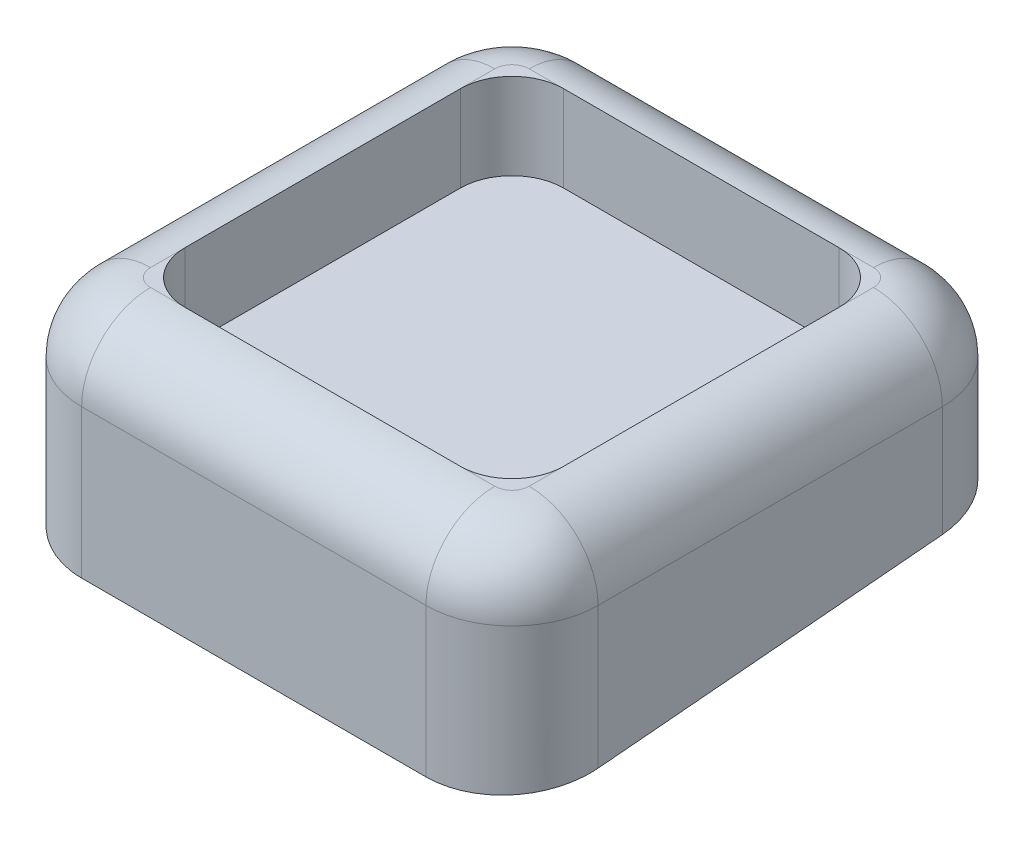
ISO-10303-21;
HEADER;
FILE_DESCRIPTION(('STEP AP214'),'2;1');
FILE_NAME('part.step','',(''),(''),'','','');
FILE_SCHEMA(('AUTOMOTIVE_DESIGN { 1 0 10303 214 1 1 1 1 }'));
ENDSEC;
DATA;
#1=APPLICATION_CONTEXT('core data for automotive mechanical design processes');
#2=APPLICATION_PROTOCOL_DEFINITION('international standard','automotive_design',2000,#1);
#3=PRODUCT_CONTEXT('',#1,'mechanical');
#4=PRODUCT('Part','Part','',(#3));
#5=PRODUCT_RELATED_PRODUCT_CATEGORY('part','',(#4));
#6=PRODUCT_DEFINITION_FORMATION('','',#4);
#7=PRODUCT_DEFINITION_CONTEXT('part definition',#1,'design');
#8=PRODUCT_DEFINITION('design','',#6,#7);
#9=PRODUCT_DEFINITION_SHAPE('','',#8);
#10=(LENGTH_UNIT() NAMED_UNIT(*) SI_UNIT(.MILLI.,.METRE.));
#11=(NAMED_UNIT(*) PLANE_ANGLE_UNIT() SI_UNIT($,.RADIAN.));
#12=(NAMED_UNIT(*) SI_UNIT($,.STERADIAN.) SOLID_ANGLE_UNIT());
#13=UNCERTAINTY_MEASURE_WITH_UNIT(LENGTH_MEASURE(1.E-05),#10,'distance_accuracy_value','');
#14=(GEOMETRIC_REPRESENTATION_CONTEXT(3) GLOBAL_UNCERTAINTY_ASSIGNED_CONTEXT((#13)) GLOBAL_UNIT_ASSIGNED_CONTEXT((#10,
#11,#12)) REPRESENTATION_CONTEXT('',''));
#15=CARTESIAN_POINT('',(0.,0.,0.));
#16=DIRECTION('',(0.,0.,1.));
#17=DIRECTION('',(1.,0.,0.));
#18=AXIS2_PLACEMENT_3D('',#15,#16,#17);
#19=CARTESIAN_POINT('',(30.,5.,0.));
#20=DIRECTION('',(0.,1.,0.));
#21=DIRECTION('',(0.,0.,1.));
#22=AXIS2_PLACEMENT_3D('',#19,#20,#21);
#23=PLANE('',#22);
#24=CARTESIAN_POINT('',(25.,5.,10.));
#25=DIRECTION('',(0.,1.,0.));
#26=DIRECTION('',(0.,0.,1.));
#27=AXIS2_PLACEMENT_3D('',#24,#25,#26);
#28=CIRCLE('',#27,1.);
#29=CARTESIAN_POINT('',(25.,5.,11.));
#30=VERTEX_POINT('',#29);
#31=CARTESIAN_POINT('',(26.,5.,10.));
#32=VERTEX_POINT('',#31);
#33=EDGE_CURVE('E280',#30,#32,#28,.T.);
#34=ORIENTED_EDGE('',*,*,#33,.T.);
#35=DIRECTION('',(0.,0.,-1.));
#36=VECTOR('',#35,1.);
#37=CARTESIAN_POINT('',(26.,5.,0.));
#38=LINE('',#37,#36);
#39=CARTESIAN_POINT('',(26.,5.,8.));
#40=VERTEX_POINT('',#39);
#41=EDGE_CURVE('E282',#32,#40,#38,.T.);
#42=ORIENTED_EDGE('',*,*,#41,.T.);
#43=CARTESIAN_POINT('',(23.,5.,8.));
#44=DIRECTION('',(0.,1.,0.));
#45=DIRECTION('',(0.,0.,1.));
#46=AXIS2_PLACEMENT_3D('',#43,#44,#45);
#47=CIRCLE('',#46,3.);
#48=CARTESIAN_POINT('',(23.,5.,11.));
#49=VERTEX_POINT('',#48);
#50=EDGE_CURVE('E255',#40,#49,#47,.F.);
#51=ORIENTED_EDGE('',*,*,#50,.T.);
#52=DIRECTION('',(-1.,0.,0.));
#53=VECTOR('',#52,1.);
#54=CARTESIAN_POINT('',(25.,5.,11.));
#55=LINE('',#54,#53);
#56=EDGE_CURVE('E278',#49,#30,#55,.F.);
#57=ORIENTED_EDGE('',*,*,#56,.T.);
#58=EDGE_LOOP('',(#34,#42,#51,#57));
#59=FACE_BOUND('',#58,.T.);
#60=ADVANCED_FACE('F37',(#59),#23,.T.);
#61=CARTESIAN_POINT('',(5.,5.,10.));
#62=DIRECTION('',(0.,1.,0.));
#63=DIRECTION('',(0.,0.,1.));
#64=AXIS2_PLACEMENT_3D('',#61,#62,#63);
#65=CIRCLE('',#64,1.);
#66=CARTESIAN_POINT('',(4.,5.,10.));
#67=VERTEX_POINT('',#66);
#68=CARTESIAN_POINT('',(5.,5.,11.));
#69=VERTEX_POINT('',#68);
#70=EDGE_CURVE('E274',#67,#69,#65,.T.);
#71=ORIENTED_EDGE('',*,*,#70,.T.);
#72=DIRECTION('',(-1.,0.,0.));
#73=VECTOR('',#72,1.);
#74=CARTESIAN_POINT('',(25.,5.,11.));
#75=LINE('',#74,#73);
#76=CARTESIAN_POINT('',(7.,5.,11.));
#77=VERTEX_POINT('',#76);
#78=EDGE_CURVE('E276',#69,#77,#75,.F.);
#79=ORIENTED_EDGE('',*,*,#78,.T.);
#80=CARTESIAN_POINT('',(7.,5.,8.));
#81=DIRECTION('',(0.,1.,0.));
#82=DIRECTION('',(0.,0.,1.));
#83=AXIS2_PLACEMENT_3D('',#80,#81,#82);
#84=CIRCLE('',#83,3.);
#85=CARTESIAN_POINT('',(4.,5.,8.));
#86=VERTEX_POINT('',#85);
#87=EDGE_CURVE('E253',#77,#86,#84,.F.);
#88=ORIENTED_EDGE('',*,*,#87,.T.);
#89=DIRECTION('',(0.,0.,-1.));
#90=VECTOR('',#89,1.);
#91=CARTESIAN_POINT('',(4.,5.,10.));
#92=LINE('',#91,#90);
#93=EDGE_CURVE('E272',#86,#67,#92,.F.);
#94=ORIENTED_EDGE('',*,*,#93,.T.);
#95=EDGE_LOOP('',(#71,#79,#88,#94));
#96=FACE_BOUND('',#95,.T.);
#97=ADVANCED_FACE('F435',(#96),#23,.T.);
#98=CARTESIAN_POINT('',(23.,5.,-8.));
#99=DIRECTION('',(0.,1.,0.));
#100=DIRECTION('',(0.,0.,1.));
#101=AXIS2_PLACEMENT_3D('',#98,#99,#100);
#102=CIRCLE('',#101,3.);
#103=CARTESIAN_POINT('',(23.,5.,-11.));
#104=VERTEX_POINT('',#103);
#105=CARTESIAN_POINT('',(26.,5.,-8.));
#106=VERTEX_POINT('',#105);
#107=EDGE_CURVE('E257',#104,#106,#102,.F.);
#108=ORIENTED_EDGE('',*,*,#107,.T.);
#109=DIRECTION('',(0.,0.,-1.));
#110=VECTOR('',#109,1.);
#111=CARTESIAN_POINT('',(26.,5.,0.));
#112=LINE('',#111,#110);
#113=CARTESIAN_POINT('',(26.,5.,-10.));
#114=VERTEX_POINT('',#113);
#115=EDGE_CURVE('E270',#106,#114,#112,.T.);
#116=ORIENTED_EDGE('',*,*,#115,.T.);
#117=CARTESIAN_POINT('',(25.,5.,-10.));
#118=DIRECTION('',(0.,1.,0.));
#119=DIRECTION('',(0.,0.,1.));
#120=AXIS2_PLACEMENT_3D('',#117,#118,#119);
#121=CIRCLE('',#120,1.);
#122=CARTESIAN_POINT('',(25.,5.,-11.));
#123=VERTEX_POINT('',#122);
#124=EDGE_CURVE('E267',#114,#123,#121,.T.);
#125=ORIENTED_EDGE('',*,*,#124,.T.);
#126=DIRECTION('',(-1.,0.,0.));
#127=VECTOR('',#126,1.);
#128=CARTESIAN_POINT('',(5.,5.,-11.));
#129=LINE('',#128,#127);
#130=EDGE_CURVE('E265',#123,#104,#129,.T.);
#131=ORIENTED_EDGE('',*,*,#130,.T.);
#132=EDGE_LOOP('',(#108,#116,#125,#131));
#133=FACE_BOUND('',#132,.T.);
#134=ADVANCED_FACE('F410',(#133),#23,.T.);
#135=CARTESIAN_POINT('',(30.,0.,15.));
#136=DIRECTION('',(0.,0.,-1.));
#137=DIRECTION('',(-1.,0.,0.));
#138=AXIS2_PLACEMENT_3D('',#135,#136,#137);
#139=PLANE('',#138);
#140=DIRECTION('',(0.,-1.,0.));
#141=VECTOR('',#140,1.);
#142=CARTESIAN_POINT('',(25.,5.,15.));
#143=LINE('',#142,#141);
#144=CARTESIAN_POINT('',(25.,-7.625,15.));
#145=VERTEX_POINT('',#144);
#146=CARTESIAN_POINT('',(25.,1.,15.));
#147=VERTEX_POINT('',#146);
#148=EDGE_CURVE('E192',#145,#147,#143,.F.);
#149=ORIENTED_EDGE('',*,*,#148,.T.);
#150=DIRECTION('',(-1.,0.,0.));
#151=VECTOR('',#150,1.);
#152=CARTESIAN_POINT('',(5.,1.,15.));
#153=LINE('',#152,#151);
#154=CARTESIAN_POINT('',(5.,1.,15.));
#155=VERTEX_POINT('',#154);
#156=EDGE_CURVE('E290',#147,#155,#153,.T.);
#157=ORIENTED_EDGE('',*,*,#156,.T.);
#158=DIRECTION('',(0.,-1.,0.));
#159=VECTOR('',#158,1.);
#160=CARTESIAN_POINT('',(5.,0.,15.));
#161=LINE('',#160,#159);
#162=CARTESIAN_POINT('',(5.,-7.625,15.));
#163=VERTEX_POINT('',#162);
#164=EDGE_CURVE('E187',#155,#163,#161,.T.);
#165=ORIENTED_EDGE('',*,*,#164,.T.);
#166=DIRECTION('',(-1.,0.,0.));
#167=VECTOR('',#166,1.);
#168=CARTESIAN_POINT('',(30.,-7.625,15.));
#169=LINE('',#168,#167);
#170=EDGE_CURVE('E180',#145,#163,#169,.T.);
#171=ORIENTED_EDGE('',*,*,#170,.F.);
#172=EDGE_LOOP('',(#149,#157,#165,#171));
#173=FACE_BOUND('',#172,.T.);
#174=ADVANCED_FACE('F191',(#173),#139,.F.);
#175=CARTESIAN_POINT('',(30.,-6.2645371375407,-0.548146999534811));
#176=DIRECTION('',(0.,0.996193717496113,0.0871669502809099));
#177=DIRECTION('',(0.,-0.0871669502809099,0.996193717496113));
#178=AXIS2_PLACEMENT_3D('',#175,#176,#177);
#179=PLANE('',#178);
#180=ORIENTED_EDGE('',*,*,#170,.T.);
#181=CARTESIAN_POINT('',(5.,-7.1875,10.));
#182=DIRECTION('',(0.,0.996193717496113,0.0871669502809099));
#183=DIRECTION('',(0.,-0.0871669502809099,0.996193717496113));
#184=AXIS2_PLACEMENT_3D('',#181,#182,#183);
#185=ELLIPSE('',#184,5.01910412822846,5.);
#186=CARTESIAN_POINT('',(0.,-7.1875,10.));
#187=VERTEX_POINT('',#186);
#188=EDGE_CURVE('E208',#163,#187,#185,.F.);
#189=ORIENTED_EDGE('',*,*,#188,.T.);
#190=DIRECTION('',(0.,0.0871669502809099,-0.996193717496113));
#191=VECTOR('',#190,1.);
#192=CARTESIAN_POINT('',(0.,-6.2645371375407,-0.548146999534811));
#193=LINE('',#192,#191);
#194=CARTESIAN_POINT('',(0.,-5.4375,-10.));
#195=VERTEX_POINT('',#194);
#196=EDGE_CURVE('E341',#187,#195,#193,.T.);
#197=ORIENTED_EDGE('',*,*,#196,.T.);
#198=CARTESIAN_POINT('',(5.,-5.4375,-10.));
#199=DIRECTION('',(0.,0.996193717496113,0.0871669502809099));
#200=DIRECTION('',(0.,0.0871669502809099,-0.996193717496113));
#201=AXIS2_PLACEMENT_3D('',#198,#199,#200);
#202=ELLIPSE('',#201,5.01910412822846,5.);
#203=CARTESIAN_POINT('',(5.,-5.,-15.));
#204=VERTEX_POINT('',#203);
#205=EDGE_CURVE('E206',#195,#204,#202,.F.);
#206=ORIENTED_EDGE('',*,*,#205,.T.);
#207=DIRECTION('',(-1.,0.,0.));
#208=VECTOR('',#207,1.);
#209=CARTESIAN_POINT('',(30.,-5.,-15.));
#210=LINE('',#209,#208);
#211=CARTESIAN_POINT('',(25.,-5.,-15.));
#212=VERTEX_POINT('',#211);
#213=EDGE_CURVE('E196',#212,#204,#210,.T.);
#214=ORIENTED_EDGE('',*,*,#213,.F.);
#215=CARTESIAN_POINT('',(25.,-5.4375,-10.));
#216=DIRECTION('',(0.,0.996193717496113,0.0871669502809099));
#217=DIRECTION('',(0.,-0.0871669502809099,0.996193717496113));
#218=AXIS2_PLACEMENT_3D('',#215,#216,#217);
#219=ELLIPSE('',#218,5.01910412822846,5.);
#220=CARTESIAN_POINT('',(30.,-5.4375,-10.));
#221=VERTEX_POINT('',#220);
#222=EDGE_CURVE('E186',#212,#221,#219,.F.);
#223=ORIENTED_EDGE('',*,*,#222,.T.);
#224=DIRECTION('',(0.,0.0871669502809099,-0.996193717496113));
#225=VECTOR('',#224,1.);
#226=CARTESIAN_POINT('',(30.,-6.2645371375407,-0.548146999534811));
#227=LINE('',#226,#225);
#228=CARTESIAN_POINT('',(30.,-7.1875,10.));
#229=VERTEX_POINT('',#228);
#230=EDGE_CURVE('E182',#229,#221,#227,.T.);
#231=ORIENTED_EDGE('',*,*,#230,.F.);
#232=CARTESIAN_POINT('',(25.,-7.1875,10.));
#233=DIRECTION('',(0.,0.996193717496113,0.0871669502809099));
#234=DIRECTION('',(0.,0.0871669502809099,-0.996193717496113));
#235=AXIS2_PLACEMENT_3D('',#232,#233,#234);
#236=ELLIPSE('',#235,5.01910412822846,5.);
#237=EDGE_CURVE('E177',#229,#145,#236,.F.);
#238=ORIENTED_EDGE('',*,*,#237,.T.);
#239=EDGE_LOOP('',(#180,#189,#197,#206,#214,#223,#231,#238));
#240=FACE_BOUND('',#239,.T.);
#241=ADVANCED_FACE('F179',(#240),#179,.F.);
#242=CARTESIAN_POINT('',(30.,0.,-15.));
#243=DIRECTION('',(0.,0.,1.));
#244=DIRECTION('',(1.,0.,0.));
#245=AXIS2_PLACEMENT_3D('',#242,#243,#244);
#246=PLANE('',#245);
#247=DIRECTION('',(0.,1.,0.));
#248=VECTOR('',#247,1.);
#249=CARTESIAN_POINT('',(5.,0.,-15.));
#250=LINE('',#249,#248);
#251=CARTESIAN_POINT('',(5.,1.,-15.));
#252=VERTEX_POINT('',#251);
#253=EDGE_CURVE('E216',#204,#252,#250,.T.);
#254=ORIENTED_EDGE('',*,*,#253,.T.);
#255=DIRECTION('',(-1.,0.,0.));
#256=VECTOR('',#255,1.);
#257=CARTESIAN_POINT('',(25.,1.,-15.));
#258=LINE('',#257,#256);
#259=CARTESIAN_POINT('',(25.,1.,-15.));
#260=VERTEX_POINT('',#259);
#261=EDGE_CURVE('E11',#252,#260,#258,.F.);
#262=ORIENTED_EDGE('',*,*,#261,.T.);
#263=DIRECTION('',(0.,1.,0.));
#264=VECTOR('',#263,1.);
#265=CARTESIAN_POINT('',(25.,-5.,-15.));
#266=LINE('',#265,#264);
#267=EDGE_CURVE('E214',#260,#212,#266,.F.);
#268=ORIENTED_EDGE('',*,*,#267,.T.);
#269=ORIENTED_EDGE('',*,*,#213,.T.);
#270=EDGE_LOOP('',(#254,#262,#268,#269));
#271=FACE_BOUND('',#270,.T.);
#272=ADVANCED_FACE('F346',(#271),#246,.F.);
#273=CARTESIAN_POINT('',(5.,5.,-10.));
#274=DIRECTION('',(0.,1.,0.));
#275=DIRECTION('',(0.,0.,1.));
#276=AXIS2_PLACEMENT_3D('',#273,#274,#275);
#277=CIRCLE('',#276,1.);
#278=CARTESIAN_POINT('',(5.,5.,-11.));
#279=VERTEX_POINT('',#278);
#280=CARTESIAN_POINT('',(4.,5.,-10.));
#281=VERTEX_POINT('',#280);
#282=EDGE_CURVE('E261',#279,#281,#277,.T.);
#283=ORIENTED_EDGE('',*,*,#282,.T.);
#284=DIRECTION('',(0.,0.,-1.));
#285=VECTOR('',#284,1.);
#286=CARTESIAN_POINT('',(4.,5.,10.));
#287=LINE('',#286,#285);
#288=CARTESIAN_POINT('',(4.,5.,-8.));
#289=VERTEX_POINT('',#288);
#290=EDGE_CURVE('E263',#281,#289,#287,.F.);
#291=ORIENTED_EDGE('',*,*,#290,.T.);
#292=CARTESIAN_POINT('',(7.,5.,-8.));
#293=DIRECTION('',(0.,1.,0.));
#294=DIRECTION('',(0.,0.,1.));
#295=AXIS2_PLACEMENT_3D('',#292,#293,#294);
#296=CIRCLE('',#295,3.);
#297=CARTESIAN_POINT('',(7.,5.,-11.));
#298=VERTEX_POINT('',#297);
#299=EDGE_CURVE('E251',#289,#298,#296,.F.);
#300=ORIENTED_EDGE('',*,*,#299,.T.);
#301=DIRECTION('',(-1.,0.,0.));
#302=VECTOR('',#301,1.);
#303=CARTESIAN_POINT('',(5.,5.,-11.));
#304=LINE('',#303,#302);
#305=EDGE_CURVE('E259',#298,#279,#304,.T.);
#306=ORIENTED_EDGE('',*,*,#305,.T.);
#307=EDGE_LOOP('',(#283,#291,#300,#306));
#308=FACE_BOUND('',#307,.T.);
#309=ADVANCED_FACE('F423',(#308),#23,.T.);
#310=CARTESIAN_POINT('',(30.,0.,0.));
#311=DIRECTION('',(1.,0.,0.));
#312=DIRECTION('',(0.,0.,-1.));
#313=AXIS2_PLACEMENT_3D('',#310,#311,#312);
#314=PLANE('',#313);
#315=DIRECTION('',(0.,1.,0.));
#316=VECTOR('',#315,1.);
#317=CARTESIAN_POINT('',(30.,5.,-10.));
#318=LINE('',#317,#316);
#319=CARTESIAN_POINT('',(30.,1.,-10.));
#320=VERTEX_POINT('',#319);
#321=EDGE_CURVE('E220',#221,#320,#318,.T.);
#322=ORIENTED_EDGE('',*,*,#321,.T.);
#323=DIRECTION('',(0.,0.,-1.));
#324=VECTOR('',#323,1.);
#325=CARTESIAN_POINT('',(30.,1.,0.));
#326=LINE('',#325,#324);
#327=CARTESIAN_POINT('',(30.,1.,10.));
#328=VERTEX_POINT('',#327);
#329=EDGE_CURVE('E287',#320,#328,#326,.F.);
#330=ORIENTED_EDGE('',*,*,#329,.T.);
#331=DIRECTION('',(0.,-1.,0.));
#332=VECTOR('',#331,1.);
#333=CARTESIAN_POINT('',(30.,-7.625,10.));
#334=LINE('',#333,#332);
#335=EDGE_CURVE('E218',#328,#229,#334,.T.);
#336=ORIENTED_EDGE('',*,*,#335,.T.);
#337=ORIENTED_EDGE('',*,*,#230,.T.);
#338=EDGE_LOOP('',(#322,#330,#336,#337));
#339=FACE_BOUND('',#338,.T.);
#340=ADVANCED_FACE('F389',(#339),#314,.T.);
#341=CARTESIAN_POINT('',(0.,0.,0.));
#342=DIRECTION('',(1.,0.,0.));
#343=DIRECTION('',(0.,0.,-1.));
#344=AXIS2_PLACEMENT_3D('',#341,#342,#343);
#345=PLANE('',#344);
#346=DIRECTION('',(0.,-1.,0.));
#347=VECTOR('',#346,1.);
#348=CARTESIAN_POINT('',(0.,0.,10.));
#349=LINE('',#348,#347);
#350=CARTESIAN_POINT('',(0.,1.,10.));
#351=VERTEX_POINT('',#350);
#352=EDGE_CURVE('E212',#187,#351,#349,.F.);
#353=ORIENTED_EDGE('',*,*,#352,.T.);
#354=DIRECTION('',(0.,0.,-1.));
#355=VECTOR('',#354,1.);
#356=CARTESIAN_POINT('',(0.,1.,-10.));
#357=LINE('',#356,#355);
#358=CARTESIAN_POINT('',(0.,1.,-10.));
#359=VERTEX_POINT('',#358);
#360=EDGE_CURVE('E61',#351,#359,#357,.T.);
#361=ORIENTED_EDGE('',*,*,#360,.T.);
#362=DIRECTION('',(0.,1.,0.));
#363=VECTOR('',#362,1.);
#364=CARTESIAN_POINT('',(0.,0.,-10.));
#365=LINE('',#364,#363);
#366=EDGE_CURVE('E210',#359,#195,#365,.F.);
#367=ORIENTED_EDGE('',*,*,#366,.T.);
#368=ORIENTED_EDGE('',*,*,#196,.F.);
#369=EDGE_LOOP('',(#353,#361,#367,#368));
#370=FACE_BOUND('',#369,.T.);
#371=ADVANCED_FACE('F355',(#370),#345,.F.);
#372=CARTESIAN_POINT('',(26.,0.,11.));
#373=DIRECTION('',(0.,0.,1.));
#374=DIRECTION('',(1.,0.,0.));
#375=AXIS2_PLACEMENT_3D('',#372,#373,#374);
#376=PLANE('',#375);
#377=DIRECTION('',(1.,0.,0.));
#378=VECTOR('',#377,1.);
#379=CARTESIAN_POINT('',(26.,0.,11.));
#380=LINE('',#379,#378);
#381=CARTESIAN_POINT('',(7.,0.,11.));
#382=VERTEX_POINT('',#381);
#383=CARTESIAN_POINT('',(23.,0.,11.));
#384=VERTEX_POINT('',#383);
#385=EDGE_CURVE('E339',#382,#384,#380,.T.);
#386=ORIENTED_EDGE('',*,*,#385,.F.);
#387=DIRECTION('',(0.,1.,0.));
#388=VECTOR('',#387,1.);
#389=CARTESIAN_POINT('',(7.,5.,11.));
#390=LINE('',#389,#388);
#391=EDGE_CURVE('E243',#382,#77,#390,.T.);
#392=ORIENTED_EDGE('',*,*,#391,.T.);
#393=DIRECTION('',(1.,0.,0.));
#394=VECTOR('',#393,1.);
#395=CARTESIAN_POINT('',(26.,5.,11.));
#396=LINE('',#395,#394);
#397=EDGE_CURVE('E317',#77,#49,#396,.T.);
#398=ORIENTED_EDGE('',*,*,#397,.T.);
#399=DIRECTION('',(0.,1.,0.));
#400=VECTOR('',#399,1.);
#401=CARTESIAN_POINT('',(23.,0.,11.));
#402=LINE('',#401,#400);
#403=EDGE_CURVE('E241',#49,#384,#402,.F.);
#404=ORIENTED_EDGE('',*,*,#403,.T.);
#405=EDGE_LOOP('',(#386,#392,#398,#404));
#406=FACE_BOUND('',#405,.T.);
#407=ADVANCED_FACE('F442',(#406),#376,.F.);
#408=CARTESIAN_POINT('',(4.,0.,11.));
#409=DIRECTION('',(-1.,0.,0.));
#410=DIRECTION('',(0.,0.,1.));
#411=AXIS2_PLACEMENT_3D('',#408,#409,#410);
#412=PLANE('',#411);
#413=DIRECTION('',(0.,0.,1.));
#414=VECTOR('',#413,1.);
#415=CARTESIAN_POINT('',(4.,0.,11.));
#416=LINE('',#415,#414);
#417=CARTESIAN_POINT('',(4.,0.,-8.));
#418=VERTEX_POINT('',#417);
#419=CARTESIAN_POINT('',(4.,0.,8.));
#420=VERTEX_POINT('',#419);
#421=EDGE_CURVE('E331',#418,#420,#416,.T.);
#422=ORIENTED_EDGE('',*,*,#421,.F.);
#423=DIRECTION('',(0.,1.,0.));
#424=VECTOR('',#423,1.);
#425=CARTESIAN_POINT('',(4.,5.,-8.));
#426=LINE('',#425,#424);
#427=EDGE_CURVE('E225',#418,#289,#426,.T.);
#428=ORIENTED_EDGE('',*,*,#427,.T.);
#429=DIRECTION('',(0.,0.,1.));
#430=VECTOR('',#429,1.);
#431=CARTESIAN_POINT('',(4.,5.,11.));
#432=LINE('',#431,#430);
#433=EDGE_CURVE('E336',#289,#86,#432,.T.);
#434=ORIENTED_EDGE('',*,*,#433,.T.);
#435=DIRECTION('',(0.,1.,0.));
#436=VECTOR('',#435,1.);
#437=CARTESIAN_POINT('',(4.,0.,8.));
#438=LINE('',#437,#436);
#439=EDGE_CURVE('E223',#86,#420,#438,.F.);
#440=ORIENTED_EDGE('',*,*,#439,.T.);
#441=EDGE_LOOP('',(#422,#428,#434,#440));
#442=FACE_BOUND('',#441,.T.);
#443=ADVANCED_FACE('F431',(#442),#412,.F.);
#444=CARTESIAN_POINT('',(26.,0.,-11.));
#445=DIRECTION('',(0.,0.,-1.));
#446=DIRECTION('',(-1.,0.,0.));
#447=AXIS2_PLACEMENT_3D('',#444,#445,#446);
#448=PLANE('',#447);
#449=DIRECTION('',(-1.,0.,0.));
#450=VECTOR('',#449,1.);
#451=CARTESIAN_POINT('',(26.,5.,-11.));
#452=LINE('',#451,#450);
#453=EDGE_CURVE('E328',#104,#298,#452,.T.);
#454=ORIENTED_EDGE('',*,*,#453,.T.);
#455=DIRECTION('',(0.,1.,0.));
#456=VECTOR('',#455,1.);
#457=CARTESIAN_POINT('',(7.,0.,-11.));
#458=LINE('',#457,#456);
#459=CARTESIAN_POINT('',(7.,0.,-11.));
#460=VERTEX_POINT('',#459);
#461=EDGE_CURVE('E231',#298,#460,#458,.F.);
#462=ORIENTED_EDGE('',*,*,#461,.T.);
#463=DIRECTION('',(-1.,0.,0.));
#464=VECTOR('',#463,1.);
#465=CARTESIAN_POINT('',(26.,0.,-11.));
#466=LINE('',#465,#464);
#467=CARTESIAN_POINT('',(23.,0.,-11.));
#468=VERTEX_POINT('',#467);
#469=EDGE_CURVE('E421',#468,#460,#466,.T.);
#470=ORIENTED_EDGE('',*,*,#469,.F.);
#471=DIRECTION('',(0.,1.,0.));
#472=VECTOR('',#471,1.);
#473=CARTESIAN_POINT('',(23.,5.,-11.));
#474=LINE('',#473,#472);
#475=EDGE_CURVE('E228',#468,#104,#474,.T.);
#476=ORIENTED_EDGE('',*,*,#475,.T.);
#477=EDGE_LOOP('',(#454,#462,#470,#476));
#478=FACE_BOUND('',#477,.T.);
#479=ADVANCED_FACE('F418',(#478),#448,.F.);
#480=CARTESIAN_POINT('',(26.,0.,11.));
#481=DIRECTION('',(1.,0.,0.));
#482=DIRECTION('',(0.,0.,-1.));
#483=AXIS2_PLACEMENT_3D('',#480,#481,#482);
#484=PLANE('',#483);
#485=DIRECTION('',(0.,0.,-1.));
#486=VECTOR('',#485,1.);
#487=CARTESIAN_POINT('',(26.,0.,11.));
#488=LINE('',#487,#486);
#489=CARTESIAN_POINT('',(26.,0.,8.));
#490=VERTEX_POINT('',#489);
#491=CARTESIAN_POINT('',(26.,0.,-8.));
#492=VERTEX_POINT('',#491);
#493=EDGE_CURVE('E408',#490,#492,#488,.T.);
#494=ORIENTED_EDGE('',*,*,#493,.F.);
#495=DIRECTION('',(0.,1.,0.));
#496=VECTOR('',#495,1.);
#497=CARTESIAN_POINT('',(26.,5.,8.));
#498=LINE('',#497,#496);
#499=EDGE_CURVE('E248',#490,#40,#498,.T.);
#500=ORIENTED_EDGE('',*,*,#499,.T.);
#501=DIRECTION('',(0.,0.,-1.));
#502=VECTOR('',#501,1.);
#503=CARTESIAN_POINT('',(26.,5.,11.));
#504=LINE('',#503,#502);
#505=EDGE_CURVE('E322',#40,#106,#504,.T.);
#506=ORIENTED_EDGE('',*,*,#505,.T.);
#507=DIRECTION('',(0.,1.,0.));
#508=VECTOR('',#507,1.);
#509=CARTESIAN_POINT('',(26.,0.,-8.));
#510=LINE('',#509,#508);
#511=EDGE_CURVE('E246',#106,#492,#510,.F.);
#512=ORIENTED_EDGE('',*,*,#511,.T.);
#513=EDGE_LOOP('',(#494,#500,#506,#512));
#514=FACE_BOUND('',#513,.T.);
#515=ADVANCED_FACE('F405',(#514),#484,.F.);
#516=CARTESIAN_POINT('',(0.,0.,0.));
#517=DIRECTION('',(0.,-1.,0.));
#518=DIRECTION('',(0.,0.,-1.));
#519=AXIS2_PLACEMENT_3D('',#516,#517,#518);
#520=PLANE('',#519);
#521=ORIENTED_EDGE('',*,*,#469,.T.);
#522=CARTESIAN_POINT('',(7.,0.,-8.));
#523=DIRECTION('',(0.,-1.,0.));
#524=DIRECTION('',(0.,0.,-1.));
#525=AXIS2_PLACEMENT_3D('',#522,#523,#524);
#526=CIRCLE('',#525,3.);
#527=EDGE_CURVE('E239',#460,#418,#526,.F.);
#528=ORIENTED_EDGE('',*,*,#527,.T.);
#529=ORIENTED_EDGE('',*,*,#421,.T.);
#530=CARTESIAN_POINT('',(7.,0.,8.));
#531=DIRECTION('',(0.,-1.,0.));
#532=DIRECTION('',(0.,0.,-1.));
#533=AXIS2_PLACEMENT_3D('',#530,#531,#532);
#534=CIRCLE('',#533,3.);
#535=EDGE_CURVE('E237',#420,#382,#534,.F.);
#536=ORIENTED_EDGE('',*,*,#535,.T.);
#537=ORIENTED_EDGE('',*,*,#385,.T.);
#538=CARTESIAN_POINT('',(23.,0.,8.));
#539=DIRECTION('',(0.,-1.,0.));
#540=DIRECTION('',(0.,0.,-1.));
#541=AXIS2_PLACEMENT_3D('',#538,#539,#540);
#542=CIRCLE('',#541,3.);
#543=EDGE_CURVE('E235',#384,#490,#542,.F.);
#544=ORIENTED_EDGE('',*,*,#543,.T.);
#545=ORIENTED_EDGE('',*,*,#493,.T.);
#546=CARTESIAN_POINT('',(23.,0.,-8.));
#547=DIRECTION('',(0.,-1.,0.));
#548=DIRECTION('',(0.,0.,-1.));
#549=AXIS2_PLACEMENT_3D('',#546,#547,#548);
#550=CIRCLE('',#549,3.);
#551=EDGE_CURVE('E233',#492,#468,#550,.F.);
#552=ORIENTED_EDGE('',*,*,#551,.T.);
#553=EDGE_LOOP('',(#521,#528,#529,#536,#537,#544,#545,#552));
#554=FACE_BOUND('',#553,.T.);
#555=ADVANCED_FACE('F447',(#554),#520,.F.);
#556=CARTESIAN_POINT('',(5.,0.,10.));
#557=DIRECTION('',(0.,-1.,0.));
#558=DIRECTION('',(0.,0.,-1.));
#559=AXIS2_PLACEMENT_3D('',#556,#557,#558);
#560=CYLINDRICAL_SURFACE('',#559,5.);
#561=ORIENTED_EDGE('',*,*,#164,.F.);
#562=CARTESIAN_POINT('',(5.,1.,10.));
#563=DIRECTION('',(0.,1.,0.));
#564=DIRECTION('',(0.,0.,1.));
#565=AXIS2_PLACEMENT_3D('',#562,#563,#564);
#566=CIRCLE('',#565,5.);
#567=EDGE_CURVE('E292',#155,#351,#566,.F.);
#568=ORIENTED_EDGE('',*,*,#567,.T.);
#569=ORIENTED_EDGE('',*,*,#352,.F.);
#570=ORIENTED_EDGE('',*,*,#188,.F.);
#571=EDGE_LOOP('',(#561,#568,#569,#570));
#572=FACE_BOUND('',#571,.T.);
#573=ADVANCED_FACE('F357',(#572),#560,.T.);
#574=CARTESIAN_POINT('',(5.,0.,-10.));
#575=DIRECTION('',(0.,1.,0.));
#576=DIRECTION('',(0.,0.,1.));
#577=AXIS2_PLACEMENT_3D('',#574,#575,#576);
#578=CYLINDRICAL_SURFACE('',#577,5.);
#579=ORIENTED_EDGE('',*,*,#366,.F.);
#580=CARTESIAN_POINT('',(5.,1.,-10.));
#581=DIRECTION('',(0.,1.,0.));
#582=DIRECTION('',(0.,0.,1.));
#583=AXIS2_PLACEMENT_3D('',#580,#581,#582);
#584=CIRCLE('',#583,5.);
#585=EDGE_CURVE('E46',#359,#252,#584,.F.);
#586=ORIENTED_EDGE('',*,*,#585,.T.);
#587=ORIENTED_EDGE('',*,*,#253,.F.);
#588=ORIENTED_EDGE('',*,*,#205,.F.);
#589=EDGE_LOOP('',(#579,#586,#587,#588));
#590=FACE_BOUND('',#589,.T.);
#591=ADVANCED_FACE('F351',(#590),#578,.T.);
#592=CARTESIAN_POINT('',(25.,0.,-10.));
#593=DIRECTION('',(0.,-1.,0.));
#594=DIRECTION('',(0.,0.,-1.));
#595=AXIS2_PLACEMENT_3D('',#592,#593,#594);
#596=CYLINDRICAL_SURFACE('',#595,5.);
#597=ORIENTED_EDGE('',*,*,#267,.F.);
#598=CARTESIAN_POINT('',(25.,1.,-10.));
#599=DIRECTION('',(0.,1.,0.));
#600=DIRECTION('',(0.,0.,1.));
#601=AXIS2_PLACEMENT_3D('',#598,#599,#600);
#602=CIRCLE('',#601,5.);
#603=EDGE_CURVE('E284',#260,#320,#602,.F.);
#604=ORIENTED_EDGE('',*,*,#603,.T.);
#605=ORIENTED_EDGE('',*,*,#321,.F.);
#606=ORIENTED_EDGE('',*,*,#222,.F.);
#607=EDGE_LOOP('',(#597,#604,#605,#606));
#608=FACE_BOUND('',#607,.T.);
#609=ADVANCED_FACE('F376',(#608),#596,.T.);
#610=CARTESIAN_POINT('',(25.,0.,10.));
#611=DIRECTION('',(0.,1.,0.));
#612=DIRECTION('',(0.,0.,1.));
#613=AXIS2_PLACEMENT_3D('',#610,#611,#612);
#614=CYLINDRICAL_SURFACE('',#613,5.);
#615=ORIENTED_EDGE('',*,*,#335,.F.);
#616=CARTESIAN_POINT('',(25.,1.,10.));
#617=DIRECTION('',(0.,1.,0.));
#618=DIRECTION('',(0.,0.,1.));
#619=AXIS2_PLACEMENT_3D('',#616,#617,#618);
#620=CIRCLE('',#619,5.);
#621=EDGE_CURVE('E200',#328,#147,#620,.F.);
#622=ORIENTED_EDGE('',*,*,#621,.T.);
#623=ORIENTED_EDGE('',*,*,#148,.F.);
#624=ORIENTED_EDGE('',*,*,#237,.F.);
#625=EDGE_LOOP('',(#615,#622,#623,#624));
#626=FACE_BOUND('',#625,.T.);
#627=ADVANCED_FACE('F198',(#626),#614,.T.);
#628=CARTESIAN_POINT('',(7.,0.,-8.));
#629=DIRECTION('',(0.,-1.,0.));
#630=DIRECTION('',(0.,0.,-1.));
#631=AXIS2_PLACEMENT_3D('',#628,#629,#630);
#632=CYLINDRICAL_SURFACE('',#631,3.);
#633=ORIENTED_EDGE('',*,*,#527,.F.);
#634=ORIENTED_EDGE('',*,*,#461,.F.);
#635=ORIENTED_EDGE('',*,*,#299,.F.);
#636=ORIENTED_EDGE('',*,*,#427,.F.);
#637=EDGE_LOOP('',(#633,#634,#635,#636));
#638=FACE_BOUND('',#637,.T.);
#639=ADVANCED_FACE('F428',(#638),#632,.F.);
#640=CARTESIAN_POINT('',(7.,0.,8.));
#641=DIRECTION('',(0.,-1.,0.));
#642=DIRECTION('',(0.,0.,-1.));
#643=AXIS2_PLACEMENT_3D('',#640,#641,#642);
#644=CYLINDRICAL_SURFACE('',#643,3.);
#645=ORIENTED_EDGE('',*,*,#535,.F.);
#646=ORIENTED_EDGE('',*,*,#439,.F.);
#647=ORIENTED_EDGE('',*,*,#87,.F.);
#648=ORIENTED_EDGE('',*,*,#391,.F.);
#649=EDGE_LOOP('',(#645,#646,#647,#648));
#650=FACE_BOUND('',#649,.T.);
#651=ADVANCED_FACE('F440',(#650),#644,.F.);
#652=CARTESIAN_POINT('',(23.,0.,8.));
#653=DIRECTION('',(0.,-1.,0.));
#654=DIRECTION('',(0.,0.,-1.));
#655=AXIS2_PLACEMENT_3D('',#652,#653,#654);
#656=CYLINDRICAL_SURFACE('',#655,3.);
#657=ORIENTED_EDGE('',*,*,#543,.F.);
#658=ORIENTED_EDGE('',*,*,#403,.F.);
#659=ORIENTED_EDGE('',*,*,#50,.F.);
#660=ORIENTED_EDGE('',*,*,#499,.F.);
#661=EDGE_LOOP('',(#657,#658,#659,#660));
#662=FACE_BOUND('',#661,.T.);
#663=ADVANCED_FACE('F401',(#662),#656,.F.);
#664=CARTESIAN_POINT('',(23.,0.,-8.));
#665=DIRECTION('',(0.,-1.,0.));
#666=DIRECTION('',(0.,0.,-1.));
#667=AXIS2_PLACEMENT_3D('',#664,#665,#666);
#668=CYLINDRICAL_SURFACE('',#667,3.);
#669=ORIENTED_EDGE('',*,*,#551,.F.);
#670=ORIENTED_EDGE('',*,*,#511,.F.);
#671=ORIENTED_EDGE('',*,*,#107,.F.);
#672=ORIENTED_EDGE('',*,*,#475,.F.);
#673=EDGE_LOOP('',(#669,#670,#671,#672));
#674=FACE_BOUND('',#673,.T.);
#675=ADVANCED_FACE('F415',(#674),#668,.F.);
#676=CARTESIAN_POINT('',(5.,1.,10.));
#677=DIRECTION('',(0.,1.,0.));
#678=DIRECTION('',(0.,0.,1.));
#679=AXIS2_PLACEMENT_3D('',#676,#677,#678);
#680=DEGENERATE_TOROIDAL_SURFACE('',#679,1.,4.,.T.);
#681=CARTESIAN_POINT('',(4.,1.,10.));
#682=DIRECTION('',(0.,0.,-1.));
#683=DIRECTION('',(-1.,0.,0.));
#684=AXIS2_PLACEMENT_3D('',#681,#682,#683);
#685=CIRCLE('',#684,4.);
#686=EDGE_CURVE('E311',#351,#67,#685,.T.);
#687=ORIENTED_EDGE('',*,*,#686,.F.);
#688=ORIENTED_EDGE('',*,*,#567,.F.);
#689=CARTESIAN_POINT('',(5.,1.,11.));
#690=DIRECTION('',(1.,0.,0.));
#691=DIRECTION('',(0.,0.,-1.));
#692=AXIS2_PLACEMENT_3D('',#689,#690,#691);
#693=CIRCLE('',#692,4.);
#694=EDGE_CURVE('E41',#69,#155,#693,.T.);
#695=ORIENTED_EDGE('',*,*,#694,.F.);
#696=ORIENTED_EDGE('',*,*,#70,.F.);
#697=EDGE_LOOP('',(#687,#688,#695,#696));
#698=FACE_BOUND('',#697,.T.);
#699=ADVANCED_FACE('F39',(#698),#680,.T.);
#700=CARTESIAN_POINT('',(30.,1.,11.));
#701=DIRECTION('',(1.,0.,0.));
#702=DIRECTION('',(0.,0.,-1.));
#703=AXIS2_PLACEMENT_3D('',#700,#701,#702);
#704=CYLINDRICAL_SURFACE('',#703,4.);
#705=ORIENTED_EDGE('',*,*,#694,.T.);
#706=ORIENTED_EDGE('',*,*,#156,.F.);
#707=CARTESIAN_POINT('',(25.,1.,11.));
#708=DIRECTION('',(1.,0.,0.));
#709=DIRECTION('',(0.,0.,-1.));
#710=AXIS2_PLACEMENT_3D('',#707,#708,#709);
#711=CIRCLE('',#710,4.);
#712=EDGE_CURVE('E309',#30,#147,#711,.T.);
#713=ORIENTED_EDGE('',*,*,#712,.F.);
#714=ORIENTED_EDGE('',*,*,#56,.F.);
#715=ORIENTED_EDGE('',*,*,#397,.F.);
#716=ORIENTED_EDGE('',*,*,#78,.F.);
#717=EDGE_LOOP('',(#705,#706,#713,#714,#715,#716));
#718=FACE_BOUND('',#717,.T.);
#719=ADVANCED_FACE('F395',(#718),#704,.T.);
#720=CARTESIAN_POINT('',(4.,1.,0.));
#721=DIRECTION('',(0.,0.,1.));
#722=DIRECTION('',(1.,0.,0.));
#723=AXIS2_PLACEMENT_3D('',#720,#721,#722);
#724=CYLINDRICAL_SURFACE('',#723,4.);
#725=ORIENTED_EDGE('',*,*,#433,.F.);
#726=ORIENTED_EDGE('',*,*,#290,.F.);
#727=CARTESIAN_POINT('',(4.,1.,-10.));
#728=DIRECTION('',(0.,0.,-1.));
#729=DIRECTION('',(-1.,0.,0.));
#730=AXIS2_PLACEMENT_3D('',#727,#728,#729);
#731=CIRCLE('',#730,4.);
#732=EDGE_CURVE('E306',#359,#281,#731,.T.);
#733=ORIENTED_EDGE('',*,*,#732,.F.);
#734=ORIENTED_EDGE('',*,*,#360,.F.);
#735=ORIENTED_EDGE('',*,*,#686,.T.);
#736=ORIENTED_EDGE('',*,*,#93,.F.);
#737=EDGE_LOOP('',(#725,#726,#733,#734,#735,#736));
#738=FACE_BOUND('',#737,.T.);
#739=ADVANCED_FACE('F362',(#738),#724,.T.);
#740=CARTESIAN_POINT('',(25.,1.,10.));
#741=DIRECTION('',(0.,1.,0.));
#742=DIRECTION('',(0.,0.,1.));
#743=AXIS2_PLACEMENT_3D('',#740,#741,#742);
#744=DEGENERATE_TOROIDAL_SURFACE('',#743,1.,4.,.T.);
#745=ORIENTED_EDGE('',*,*,#712,.T.);
#746=ORIENTED_EDGE('',*,*,#621,.F.);
#747=CARTESIAN_POINT('',(26.,1.,10.));
#748=DIRECTION('',(0.,0.,-1.));
#749=DIRECTION('',(-1.,0.,0.));
#750=AXIS2_PLACEMENT_3D('',#747,#748,#749);
#751=CIRCLE('',#750,4.);
#752=EDGE_CURVE('E303',#32,#328,#751,.T.);
#753=ORIENTED_EDGE('',*,*,#752,.F.);
#754=ORIENTED_EDGE('',*,*,#33,.F.);
#755=EDGE_LOOP('',(#745,#746,#753,#754));
#756=FACE_BOUND('',#755,.T.);
#757=ADVANCED_FACE('F391',(#756),#744,.T.);
#758=CARTESIAN_POINT('',(5.,1.,-10.));
#759=DIRECTION('',(0.,1.,0.));
#760=DIRECTION('',(0.,0.,1.));
#761=AXIS2_PLACEMENT_3D('',#758,#759,#760);
#762=DEGENERATE_TOROIDAL_SURFACE('',#761,1.,4.,.T.);
#763=ORIENTED_EDGE('',*,*,#732,.T.);
#764=ORIENTED_EDGE('',*,*,#282,.F.);
#765=CARTESIAN_POINT('',(5.,1.,-11.));
#766=DIRECTION('',(1.,0.,0.));
#767=DIRECTION('',(0.,0.,-1.));
#768=AXIS2_PLACEMENT_3D('',#765,#766,#767);
#769=CIRCLE('',#768,4.);
#770=EDGE_CURVE('E300',#252,#279,#769,.T.);
#771=ORIENTED_EDGE('',*,*,#770,.F.);
#772=ORIENTED_EDGE('',*,*,#585,.F.);
#773=EDGE_LOOP('',(#763,#764,#771,#772));
#774=FACE_BOUND('',#773,.T.);
#775=ADVANCED_FACE('F366',(#774),#762,.T.);
#776=CARTESIAN_POINT('',(26.,1.,0.));
#777=DIRECTION('',(0.,0.,-1.));
#778=DIRECTION('',(-1.,0.,0.));
#779=AXIS2_PLACEMENT_3D('',#776,#777,#778);
#780=CYLINDRICAL_SURFACE('',#779,4.);
#781=ORIENTED_EDGE('',*,*,#752,.T.);
#782=ORIENTED_EDGE('',*,*,#329,.F.);
#783=CARTESIAN_POINT('',(26.,1.,-10.));
#784=DIRECTION('',(0.,0.,-1.));
#785=DIRECTION('',(-1.,0.,0.));
#786=AXIS2_PLACEMENT_3D('',#783,#784,#785);
#787=CIRCLE('',#786,4.);
#788=EDGE_CURVE('E298',#114,#320,#787,.T.);
#789=ORIENTED_EDGE('',*,*,#788,.F.);
#790=ORIENTED_EDGE('',*,*,#115,.F.);
#791=ORIENTED_EDGE('',*,*,#505,.F.);
#792=ORIENTED_EDGE('',*,*,#41,.F.);
#793=EDGE_LOOP('',(#781,#782,#789,#790,#791,#792));
#794=FACE_BOUND('',#793,.T.);
#795=ADVANCED_FACE('F385',(#794),#780,.T.);
#796=CARTESIAN_POINT('',(30.,1.,-11.));
#797=DIRECTION('',(1.,0.,0.));
#798=DIRECTION('',(0.,0.,-1.));
#799=AXIS2_PLACEMENT_3D('',#796,#797,#798);
#800=CYLINDRICAL_SURFACE('',#799,4.);
#801=ORIENTED_EDGE('',*,*,#453,.F.);
#802=ORIENTED_EDGE('',*,*,#130,.F.);
#803=CARTESIAN_POINT('',(25.,1.,-11.));
#804=DIRECTION('',(1.,0.,0.));
#805=DIRECTION('',(0.,0.,-1.));
#806=AXIS2_PLACEMENT_3D('',#803,#804,#805);
#807=CIRCLE('',#806,4.);
#808=EDGE_CURVE('E296',#260,#123,#807,.T.);
#809=ORIENTED_EDGE('',*,*,#808,.F.);
#810=ORIENTED_EDGE('',*,*,#261,.F.);
#811=ORIENTED_EDGE('',*,*,#770,.T.);
#812=ORIENTED_EDGE('',*,*,#305,.F.);
#813=EDGE_LOOP('',(#801,#802,#809,#810,#811,#812));
#814=FACE_BOUND('',#813,.T.);
#815=ADVANCED_FACE('F372',(#814),#800,.T.);
#816=CARTESIAN_POINT('',(25.,1.,-10.));
#817=DIRECTION('',(0.,1.,0.));
#818=DIRECTION('',(0.,0.,1.));
#819=AXIS2_PLACEMENT_3D('',#816,#817,#818);
#820=DEGENERATE_TOROIDAL_SURFACE('',#819,1.,4.,.T.);
#821=ORIENTED_EDGE('',*,*,#788,.T.);
#822=ORIENTED_EDGE('',*,*,#603,.F.);
#823=ORIENTED_EDGE('',*,*,#808,.T.);
#824=ORIENTED_EDGE('',*,*,#124,.F.);
#825=EDGE_LOOP('',(#821,#822,#823,#824));
#826=FACE_BOUND('',#825,.T.);
#827=ADVANCED_FACE('F379',(#826),#820,.T.);
#828=CLOSED_SHELL('',(#60,#97,#134,#174,#241,#272,#309,#340,#371,#407,#443,#479,#515,#555,#573,
#591,#609,#627,#639,#651,#663,#675,#699,#719,#739,#757,#775,#795,#815,#827));
#829=MANIFOLD_SOLID_BREP('B2',#828);
#830=ADVANCED_BREP_SHAPE_REPRESENTATION('',(#18,#829),#14);
#831=SHAPE_DEFINITION_REPRESENTATION(#9,#830);
ENDSEC;
END-ISO-10303-21;
